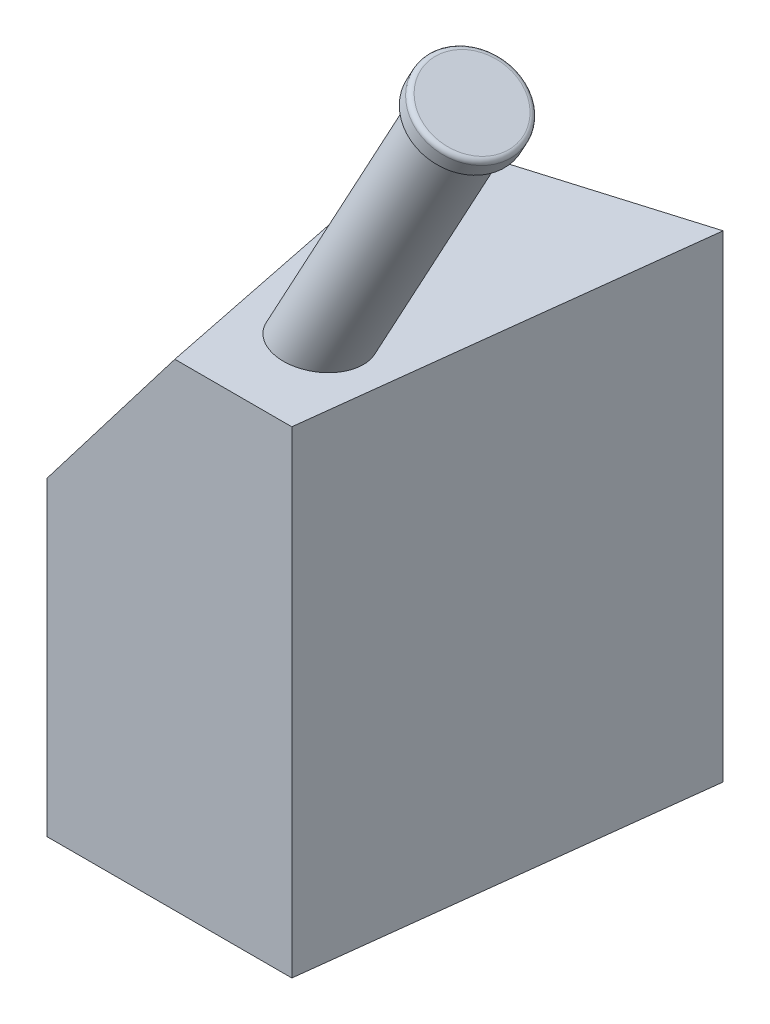
ISO-10303-21;
HEADER;
FILE_DESCRIPTION(('STEP AP214'),'2;1');
FILE_NAME('part.step','',(''),(''),'','','');
FILE_SCHEMA(('AUTOMOTIVE_DESIGN { 1 0 10303 214 1 1 1 1 }'));
ENDSEC;
DATA;
#1=APPLICATION_CONTEXT('core data for automotive mechanical design processes');
#2=APPLICATION_PROTOCOL_DEFINITION('international standard','automotive_design',2000,#1);
#3=PRODUCT_CONTEXT('',#1,'mechanical');
#4=PRODUCT('Part','Part','',(#3));
#5=PRODUCT_RELATED_PRODUCT_CATEGORY('part','',(#4));
#6=PRODUCT_DEFINITION_FORMATION('','',#4);
#7=PRODUCT_DEFINITION_CONTEXT('part definition',#1,'design');
#8=PRODUCT_DEFINITION('design','',#6,#7);
#9=PRODUCT_DEFINITION_SHAPE('','',#8);
#10=(LENGTH_UNIT() NAMED_UNIT(*) SI_UNIT(.MILLI.,.METRE.));
#11=(NAMED_UNIT(*) PLANE_ANGLE_UNIT() SI_UNIT($,.RADIAN.));
#12=(NAMED_UNIT(*) SI_UNIT($,.STERADIAN.) SOLID_ANGLE_UNIT());
#13=UNCERTAINTY_MEASURE_WITH_UNIT(LENGTH_MEASURE(1.E-05),#10,'distance_accuracy_value','');
#14=(GEOMETRIC_REPRESENTATION_CONTEXT(3) GLOBAL_UNCERTAINTY_ASSIGNED_CONTEXT((#13)) GLOBAL_UNIT_ASSIGNED_CONTEXT((#10,
#11,#12)) REPRESENTATION_CONTEXT('',''));
#15=CARTESIAN_POINT('',(0.,0.,0.));
#16=DIRECTION('',(0.,0.,1.));
#17=DIRECTION('',(1.,0.,0.));
#18=AXIS2_PLACEMENT_3D('',#15,#16,#17);
#19=CARTESIAN_POINT('',(0.,254.,0.));
#20=DIRECTION('',(0.,-1.,0.));
#21=DIRECTION('',(0.,0.,-1.));
#22=AXIS2_PLACEMENT_3D('',#19,#20,#21);
#23=PLANE('',#22);
#24=CARTESIAN_POINT('',(97.177352285412,254.,-48.3837461002978));
#25=DIRECTION('',(0.,-1.,0.));
#26=DIRECTION('',(0.992978958791117,0.,0.118291112929543));
#27=AXIS2_PLACEMENT_3D('',#24,#25,#26);
#28=ELLIPSE('',#27,23.5515031208909,20.3962);
#29=CARTESIAN_POINT('',(120.56349933236,254.,-45.5978125849641));
#30=VERTEX_POINT('',#29);
#31=EDGE_CURVE('E155',#30,#30,#28,.T.);
#32=ORIENTED_EDGE('',*,*,#31,.T.);
#33=EDGE_LOOP('',(#32));
#34=FACE_BOUND('',#33,.T.);
#35=DIRECTION('',(0.199008057425365,0.,0.979997853609784));
#36=VECTOR('',#35,1.);
#37=CARTESIAN_POINT('',(45.2188225077603,254.,-112.538483015732));
#38=LINE('',#37,#36);
#39=CARTESIAN_POINT('',(45.2188225077604,254.,-112.538483015732));
#40=VERTEX_POINT('',#39);
#41=CARTESIAN_POINT('',(68.0719999999998,254.,0.));
#42=VERTEX_POINT('',#41);
#43=EDGE_CURVE('E45',#40,#42,#38,.T.);
#44=ORIENTED_EDGE('',*,*,#43,.T.);
#45=DIRECTION('',(1.,0.,0.));
#46=VECTOR('',#45,1.);
#47=CARTESIAN_POINT('',(0.,254.,0.));
#48=LINE('',#47,#46);
#49=CARTESIAN_POINT('',(130.302,254.,0.));
#50=VERTEX_POINT('',#49);
#51=EDGE_CURVE('E123',#42,#50,#48,.T.);
#52=ORIENTED_EDGE('',*,*,#51,.T.);
#53=DIRECTION('',(0.118291112929543,0.,-0.992978958791117));
#54=VECTOR('',#53,1.);
#55=CARTESIAN_POINT('',(130.302,254.,0.));
#56=LINE('',#55,#54);
#57=CARTESIAN_POINT('',(154.729351402176,254.,-205.052140948283));
#58=VERTEX_POINT('',#57);
#59=EDGE_CURVE('E126',#50,#58,#56,.T.);
#60=ORIENTED_EDGE('',*,*,#59,.T.);
#61=DIRECTION('',(-0.958097365655433,0.,0.286442730618391));
#62=VECTOR('',#61,1.);
#63=CARTESIAN_POINT('',(154.729351402176,254.,-205.052140948283));
#64=LINE('',#63,#62);
#65=CARTESIAN_POINT('',(45.21882250776,254.,-172.311736838601));
#66=VERTEX_POINT('',#65);
#67=EDGE_CURVE('E124',#58,#66,#64,.T.);
#68=ORIENTED_EDGE('',*,*,#67,.T.);
#69=DIRECTION('',(0.,0.,-1.));
#70=VECTOR('',#69,1.);
#71=CARTESIAN_POINT('',(45.2188225077605,254.,0.));
#72=LINE('',#71,#70);
#73=EDGE_CURVE('E129',#40,#66,#72,.T.);
#74=ORIENTED_EDGE('',*,*,#73,.F.);
#75=EDGE_LOOP('',(#44,#52,#60,#68,#74));
#76=FACE_BOUND('',#75,.T.);
#77=ADVANCED_FACE('F41',(#34,#76),#23,.F.);
#78=CARTESIAN_POINT('',(0.,254.,0.));
#79=DIRECTION('',(0.,0.,-1.));
#80=DIRECTION('',(-1.,0.,0.));
#81=AXIS2_PLACEMENT_3D('',#78,#79,#80);
#82=PLANE('',#81);
#83=DIRECTION('',(-0.607955194175007,-0.793971335676314,0.));
#84=VECTOR('',#83,1.);
#85=CARTESIAN_POINT('',(68.0719999999998,254.,0.));
#86=LINE('',#85,#84);
#87=CARTESIAN_POINT('',(-2.63677968348475E-13,165.1,0.));
#88=VERTEX_POINT('',#87);
#89=EDGE_CURVE('E97',#42,#88,#86,.T.);
#90=ORIENTED_EDGE('',*,*,#89,.T.);
#91=DIRECTION('',(0.,-1.,0.));
#92=VECTOR('',#91,1.);
#93=CARTESIAN_POINT('',(0.,254.,0.));
#94=LINE('',#93,#92);
#95=CARTESIAN_POINT('',(0.,0.,0.));
#96=VERTEX_POINT('',#95);
#97=EDGE_CURVE('E114',#88,#96,#94,.T.);
#98=ORIENTED_EDGE('',*,*,#97,.T.);
#99=DIRECTION('',(1.,0.,0.));
#100=VECTOR('',#99,1.);
#101=CARTESIAN_POINT('',(0.,0.,0.));
#102=LINE('',#101,#100);
#103=CARTESIAN_POINT('',(130.302,0.,0.));
#104=VERTEX_POINT('',#103);
#105=EDGE_CURVE('E101',#96,#104,#102,.T.);
#106=ORIENTED_EDGE('',*,*,#105,.T.);
#107=DIRECTION('',(0.,-1.,0.));
#108=VECTOR('',#107,1.);
#109=CARTESIAN_POINT('',(130.302,254.,0.));
#110=LINE('',#109,#108);
#111=EDGE_CURVE('E145',#50,#104,#110,.T.);
#112=ORIENTED_EDGE('',*,*,#111,.F.);
#113=ORIENTED_EDGE('',*,*,#51,.F.);
#114=EDGE_LOOP('',(#90,#98,#106,#112,#113));
#115=FACE_BOUND('',#114,.T.);
#116=ADVANCED_FACE('F121',(#115),#82,.F.);
#117=CARTESIAN_POINT('',(-106.42833497148,349.486999869275,-103.070245851791));
#118=DIRECTION('',(-0.429494697348459,-0.61668314631266,-0.659724337889299));
#119=DIRECTION('',(0.,0.730535607294707,-0.682874605234777));
#120=AXIS2_PLACEMENT_3D('',#117,#118,#119);
#121=PLANE('',#120);
#122=DIRECTION('',(0.318497882583451,0.580154303207515,-0.749653308709874));
#123=VECTOR('',#122,1.);
#124=CARTESIAN_POINT('',(47.8838198041176,252.321942852614,-112.704874703269));
#125=LINE('',#124,#123);
#126=CARTESIAN_POINT('',(47.8838198041176,252.321942852614,-112.704874703269));
#127=VERTEX_POINT('',#126);
#128=EDGE_CURVE('E51',#88,#127,#125,.T.);
#129=ORIENTED_EDGE('',*,*,#128,.F.);
#130=DIRECTION('',(0.300705576708503,0.591185800222861,-0.748381925056493));
#131=VECTOR('',#130,1.);
#132=CARTESIAN_POINT('',(46.3505444625445,256.224960231175,-115.355059497023));
#133=LINE('',#132,#131);
#134=EDGE_CURVE('E93',#88,#40,#133,.T.);
#135=ORIENTED_EDGE('',*,*,#134,.T.);
#136=DIRECTION('',(0.845040474616106,-0.532092925647129,-0.0527609205460345));
#137=VECTOR('',#136,1.);
#138=CARTESIAN_POINT('',(-106.42833497148,349.486999869275,-103.070245851791));
#139=LINE('',#138,#137);
#140=EDGE_CURVE('E100',#40,#127,#139,.T.);
#141=ORIENTED_EDGE('',*,*,#140,.T.);
#142=EDGE_LOOP('',(#129,#135,#141));
#143=FACE_BOUND('',#142,.T.);
#144=ADVANCED_FACE('F104',(#143),#121,.T.);
#145=CARTESIAN_POINT('',(81.5417679167685,226.726887822991,-50.2463743663815));
#146=DIRECTION('',(0.496489479395559,0.866025403784438,0.0591455564647714));
#147=DIRECTION('',(-0.867544153281162,0.497360173423316,0.));
#148=AXIS2_PLACEMENT_3D('',#145,#146,#147);
#149=CYLINDRICAL_SURFACE('',#148,20.3962);
#150=CARTESIAN_POINT('',(182.428430129946,402.703249871989,-38.2279972927399));
#151=DIRECTION('',(0.496489479395559,0.866025403784438,0.0591455564647714));
#152=DIRECTION('',(-0.867544153281162,0.497360173423316,0.));
#153=AXIS2_PLACEMENT_3D('',#150,#151,#152);
#154=CIRCLE('',#153,20.3962);
#155=CARTESIAN_POINT('',(164.733826070793,412.847507441165,-38.2279972927399));
#156=VERTEX_POINT('',#155);
#157=EDGE_CURVE('E132',#156,#156,#154,.F.);
#158=ORIENTED_EDGE('',*,*,#157,.T.);
#159=EDGE_LOOP('',(#158));
#160=FACE_BOUND('',#159,.T.);
#161=ORIENTED_EDGE('',*,*,#31,.F.);
#162=EDGE_LOOP('',(#161));
#163=FACE_BOUND('',#162,.T.);
#164=ADVANCED_FACE('F203',(#160,#163),#149,.T.);
#165=CARTESIAN_POINT('',(-52.1238698428315,254.,-143.209155407773));
#166=DIRECTION('',(0.939692620785909,0.,-0.342020143325666));
#167=DIRECTION('',(-0.342020143325666,0.,-0.939692620785909));
#168=AXIS2_PLACEMENT_3D('',#165,#166,#167);
#169=PLANE('',#168);
#170=ORIENTED_EDGE('',*,*,#97,.F.);
#171=DIRECTION('',(0.311895523901746,0.410364677328798,0.856925909149027));
#172=VECTOR('',#171,1.);
#173=CARTESIAN_POINT('',(-2.08166817117217E-13,165.1,0.));
#174=LINE('',#173,#172);
#175=CARTESIAN_POINT('',(-52.1238698428316,96.5200000000001,-143.209155407773));
#176=VERTEX_POINT('',#175);
#177=EDGE_CURVE('E106',#176,#88,#174,.T.);
#178=ORIENTED_EDGE('',*,*,#177,.F.);
#179=DIRECTION('',(0.,-1.,0.));
#180=VECTOR('',#179,1.);
#181=CARTESIAN_POINT('',(-52.1238698428315,254.,-143.209155407773));
#182=LINE('',#181,#180);
#183=CARTESIAN_POINT('',(-52.1238698428315,0.,-143.209155407773));
#184=VERTEX_POINT('',#183);
#185=EDGE_CURVE('E142',#176,#184,#182,.T.);
#186=ORIENTED_EDGE('',*,*,#185,.T.);
#187=DIRECTION('',(0.342020143325666,0.,0.939692620785909));
#188=VECTOR('',#187,1.);
#189=CARTESIAN_POINT('',(-52.1238698428315,0.,-143.209155407773));
#190=LINE('',#189,#188);
#191=EDGE_CURVE('E116',#184,#96,#190,.T.);
#192=ORIENTED_EDGE('',*,*,#191,.T.);
#193=EDGE_LOOP('',(#170,#178,#186,#192));
#194=FACE_BOUND('',#193,.T.);
#195=ADVANCED_FACE('F43',(#194),#169,.F.);
#196=CARTESIAN_POINT('',(130.302,254.,0.));
#197=DIRECTION('',(-0.992978958791117,0.,-0.118291112929543));
#198=DIRECTION('',(-0.118291112929543,0.,0.992978958791117));
#199=AXIS2_PLACEMENT_3D('',#196,#197,#198);
#200=PLANE('',#199);
#201=DIRECTION('',(0.118291112929543,0.,-0.992978958791117));
#202=VECTOR('',#201,1.);
#203=CARTESIAN_POINT('',(130.302,0.,0.));
#204=LINE('',#203,#202);
#205=CARTESIAN_POINT('',(154.729351402176,0.,-205.052140948283));
#206=VERTEX_POINT('',#205);
#207=EDGE_CURVE('E141',#104,#206,#204,.T.);
#208=ORIENTED_EDGE('',*,*,#207,.T.);
#209=DIRECTION('',(0.,-1.,0.));
#210=VECTOR('',#209,1.);
#211=CARTESIAN_POINT('',(154.729351402176,254.,-205.052140948283));
#212=LINE('',#211,#210);
#213=EDGE_CURVE('E149',#58,#206,#212,.T.);
#214=ORIENTED_EDGE('',*,*,#213,.F.);
#215=ORIENTED_EDGE('',*,*,#59,.F.);
#216=ORIENTED_EDGE('',*,*,#111,.T.);
#217=EDGE_LOOP('',(#208,#214,#215,#216));
#218=FACE_BOUND('',#217,.T.);
#219=ADVANCED_FACE('F177',(#218),#200,.F.);
#220=CARTESIAN_POINT('',(154.729351402176,254.,-205.052140948283));
#221=DIRECTION('',(0.286442730618391,0.,0.958097365655433));
#222=DIRECTION('',(0.958097365655433,0.,-0.286442730618391));
#223=AXIS2_PLACEMENT_3D('',#220,#221,#222);
#224=PLANE('',#223);
#225=ORIENTED_EDGE('',*,*,#185,.F.);
#226=DIRECTION('',(-0.519410325827571,-0.840296648224245,0.155288300933441));
#227=VECTOR('',#226,1.);
#228=CARTESIAN_POINT('',(-52.1238698428316,96.5200000000001,-143.209155407773));
#229=LINE('',#228,#227);
#230=EDGE_CURVE('E91',#66,#176,#229,.T.);
#231=ORIENTED_EDGE('',*,*,#230,.F.);
#232=ORIENTED_EDGE('',*,*,#67,.F.);
#233=ORIENTED_EDGE('',*,*,#213,.T.);
#234=DIRECTION('',(-0.958097365655433,0.,0.286442730618391));
#235=VECTOR('',#234,1.);
#236=CARTESIAN_POINT('',(154.729351402176,0.,-205.052140948283));
#237=LINE('',#236,#235);
#238=EDGE_CURVE('E146',#206,#184,#237,.T.);
#239=ORIENTED_EDGE('',*,*,#238,.T.);
#240=EDGE_LOOP('',(#225,#231,#232,#233,#239));
#241=FACE_BOUND('',#240,.T.);
#242=ADVANCED_FACE('F173',(#241),#224,.F.);
#243=CARTESIAN_POINT('',(0.,0.,0.));
#244=DIRECTION('',(0.,-1.,0.));
#245=DIRECTION('',(0.,0.,-1.));
#246=AXIS2_PLACEMENT_3D('',#243,#244,#245);
#247=PLANE('',#246);
#248=ORIENTED_EDGE('',*,*,#191,.F.);
#249=ORIENTED_EDGE('',*,*,#238,.F.);
#250=ORIENTED_EDGE('',*,*,#207,.F.);
#251=ORIENTED_EDGE('',*,*,#105,.F.);
#252=EDGE_LOOP('',(#248,#249,#250,#251));
#253=FACE_BOUND('',#252,.T.);
#254=ADVANCED_FACE('F181',(#253),#247,.T.);
#255=CARTESIAN_POINT('',(183.689513407611,404.902954397601,-38.0777675793194));
#256=DIRECTION('',(0.496489479395559,0.866025403784438,0.0591455564647714));
#257=DIRECTION('',(-0.867544153281162,0.497360173423316,0.));
#258=AXIS2_PLACEMENT_3D('',#255,#256,#257);
#259=CYLINDRICAL_SURFACE('',#258,25.4762);
#260=CARTESIAN_POINT('',(187.472763240605,411.502067974438,-37.6270784390578));
#261=DIRECTION('',(0.496489479395559,0.866025403784438,0.0591455564647714));
#262=DIRECTION('',(-0.867544153281162,0.497360173423316,0.));
#263=AXIS2_PLACEMENT_3D('',#260,#261,#262);
#264=CIRCLE('',#263,25.4762);
#265=CARTESIAN_POINT('',(165.371034882783,424.172915224605,-37.6270784390578));
#266=VERTEX_POINT('',#265);
#267=EDGE_CURVE('E137',#266,#266,#264,.F.);
#268=ORIENTED_EDGE('',*,*,#267,.T.);
#269=EDGE_LOOP('',(#268));
#270=FACE_BOUND('',#269,.T.);
#271=CARTESIAN_POINT('',(183.689513407611,404.902954397601,-38.0777675793194));
#272=DIRECTION('',(0.496489479395559,0.866025403784438,0.0591455564647714));
#273=DIRECTION('',(-0.867544153281162,0.497360173423316,0.));
#274=AXIS2_PLACEMENT_3D('',#271,#272,#273);
#275=CIRCLE('',#274,25.4762);
#276=CARTESIAN_POINT('',(161.587785049789,417.573801647768,-38.0777675793194));
#277=VERTEX_POINT('',#276);
#278=EDGE_CURVE('E133',#277,#277,#275,.T.);
#279=ORIENTED_EDGE('',*,*,#278,.T.);
#280=EDGE_LOOP('',(#279));
#281=FACE_BOUND('',#280,.T.);
#282=ADVANCED_FACE('F183',(#270,#281),#259,.T.);
#283=CARTESIAN_POINT('',(183.689513407611,404.902954397601,-38.0777675793194));
#284=DIRECTION('',(0.496489479395559,0.866025403784438,0.0591455564647714));
#285=DIRECTION('',(-0.867544153281162,0.497360173423316,0.));
#286=AXIS2_PLACEMENT_3D('',#283,#284,#285);
#287=PLANE('',#286);
#288=CARTESIAN_POINT('',(183.689513407611,404.902954397601,-38.0777675793194));
#289=DIRECTION('',(0.496489479395559,0.866025403784438,0.0591455564647714));
#290=DIRECTION('',(-0.867544153281162,0.497360173423316,0.));
#291=AXIS2_PLACEMENT_3D('',#288,#289,#290);
#292=CIRCLE('',#291,22.9362);
#293=CARTESIAN_POINT('',(163.791347199124,416.310506807273,-38.0777675793194));
#294=VERTEX_POINT('',#293);
#295=EDGE_CURVE('E136',#294,#294,#292,.T.);
#296=ORIENTED_EDGE('',*,*,#295,.T.);
#297=EDGE_LOOP('',(#296));
#298=FACE_BOUND('',#297,.T.);
#299=ORIENTED_EDGE('',*,*,#278,.F.);
#300=EDGE_LOOP('',(#299));
#301=FACE_BOUND('',#300,.T.);
#302=ADVANCED_FACE('F189',(#298,#301),#287,.F.);
#303=CARTESIAN_POINT('',(188.73384651827,413.701772500051,-37.4768487256373));
#304=DIRECTION('',(0.496489479395559,0.866025403784438,0.0591455564647714));
#305=DIRECTION('',(-0.867544153281162,0.497360173423316,0.));
#306=AXIS2_PLACEMENT_3D('',#303,#304,#305);
#307=PLANE('',#306);
#308=CARTESIAN_POINT('',(188.73384651827,413.701772500051,-37.4768487256373));
#309=DIRECTION('',(0.496489479395559,0.866025403784438,0.0591455564647714));
#310=DIRECTION('',(-0.867544153281162,0.497360173423316,0.));
#311=AXIS2_PLACEMENT_3D('',#308,#309,#310);
#312=CIRCLE('',#311,22.9362);
#313=CARTESIAN_POINT('',(168.835680309782,425.109324909723,-37.4768487256373));
#314=VERTEX_POINT('',#313);
#315=EDGE_CURVE('E162',#314,#314,#312,.T.);
#316=ORIENTED_EDGE('',*,*,#315,.T.);
#317=EDGE_LOOP('',(#316));
#318=FACE_BOUND('',#317,.T.);
#319=ADVANCED_FACE('F212',(#318),#307,.T.);
#320=CARTESIAN_POINT('',(182.428430129946,402.703249871989,-38.2279972927399));
#321=DIRECTION('',(0.496489479395559,0.866025403784438,0.0591455564647714));
#322=DIRECTION('',(-0.867544153281162,0.497360173423316,0.));
#323=AXIS2_PLACEMENT_3D('',#320,#321,#322);
#324=TOROIDAL_SURFACE('',#323,22.9362,2.54);
#325=ORIENTED_EDGE('',*,*,#295,.F.);
#326=EDGE_LOOP('',(#325));
#327=FACE_BOUND('',#326,.T.);
#328=ORIENTED_EDGE('',*,*,#157,.F.);
#329=EDGE_LOOP('',(#328));
#330=FACE_BOUND('',#329,.T.);
#331=ADVANCED_FACE('F216',(#327,#330),#324,.F.);
#332=CARTESIAN_POINT('',(187.472763240605,411.502067974438,-37.6270784390578));
#333=DIRECTION('',(0.496489479395559,0.866025403784438,0.0591455564647714));
#334=DIRECTION('',(-0.867544153281162,0.497360173423316,0.));
#335=AXIS2_PLACEMENT_3D('',#332,#333,#334);
#336=TOROIDAL_SURFACE('',#335,22.9362,2.54);
#337=ORIENTED_EDGE('',*,*,#267,.F.);
#338=EDGE_LOOP('',(#337));
#339=FACE_BOUND('',#338,.T.);
#340=ORIENTED_EDGE('',*,*,#315,.F.);
#341=EDGE_LOOP('',(#340));
#342=FACE_BOUND('',#341,.T.);
#343=ADVANCED_FACE('F210',(#339,#342),#336,.T.);
#344=CARTESIAN_POINT('',(-109.093332267837,351.165057016661,-162.677107987123));
#345=DIRECTION('',(-0.532835072911024,-0.846219111741104,0.));
#346=DIRECTION('',(0.846219111741104,-0.532835072911024,0.));
#347=AXIS2_PLACEMENT_3D('',#344,#345,#346);
#348=PLANE('',#347);
#349=ORIENTED_EDGE('',*,*,#73,.T.);
#350=DIRECTION('',(-0.0446472993191084,0.0281128689459988,-0.998607172647551));
#351=VECTOR('',#350,1.);
#352=CARTESIAN_POINT('',(45.21882250776,254.,-172.311736838601));
#353=LINE('',#352,#351);
#354=EDGE_CURVE('E11',#127,#66,#353,.T.);
#355=ORIENTED_EDGE('',*,*,#354,.F.);
#356=ORIENTED_EDGE('',*,*,#140,.F.);
#357=EDGE_LOOP('',(#349,#355,#356));
#358=FACE_BOUND('',#357,.T.);
#359=ADVANCED_FACE('F169',(#358),#348,.T.);
#360=CARTESIAN_POINT('',(-74.2355736465823,46.7435877395665,4.63496994583124));
#361=DIRECTION('',(0.845040474616106,-0.532092925647129,-0.0527609205460344));
#362=DIRECTION('',(0.532835072911024,0.846219111741104,0.));
#363=AXIS2_PLACEMENT_3D('',#360,#361,#362);
#364=PLANE('',#363);
#365=ORIENTED_EDGE('',*,*,#230,.T.);
#366=ORIENTED_EDGE('',*,*,#177,.T.);
#367=ORIENTED_EDGE('',*,*,#128,.T.);
#368=ORIENTED_EDGE('',*,*,#354,.T.);
#369=EDGE_LOOP('',(#365,#366,#367,#368));
#370=FACE_BOUND('',#369,.T.);
#371=ADVANCED_FACE('F109',(#370),#364,.F.);
#372=CARTESIAN_POINT('',(-77.6744076047082,59.4764035373195,15.7733334947017));
#373=DIRECTION('',(-0.783848376900279,0.6002039000265,0.159176004547723));
#374=DIRECTION('',(-0.607955194175007,-0.793971335676314,0.));
#375=AXIS2_PLACEMENT_3D('',#372,#373,#374);
#376=PLANE('',#375);
#377=ORIENTED_EDGE('',*,*,#134,.F.);
#378=ORIENTED_EDGE('',*,*,#89,.F.);
#379=ORIENTED_EDGE('',*,*,#43,.F.);
#380=EDGE_LOOP('',(#377,#378,#379));
#381=FACE_BOUND('',#380,.T.);
#382=ADVANCED_FACE('F95',(#381),#376,.T.);
#383=CLOSED_SHELL('',(#77,#116,#144,#164,#195,#219,#242,#254,#282,#302,#319,#331,#343,#359,#371,#382));
#384=MANIFOLD_SOLID_BREP('B2',#383);
#385=ADVANCED_BREP_SHAPE_REPRESENTATION('',(#18,#384),#14);
#386=SHAPE_DEFINITION_REPRESENTATION(#9,#385);
ENDSEC;
END-ISO-10303-21;
